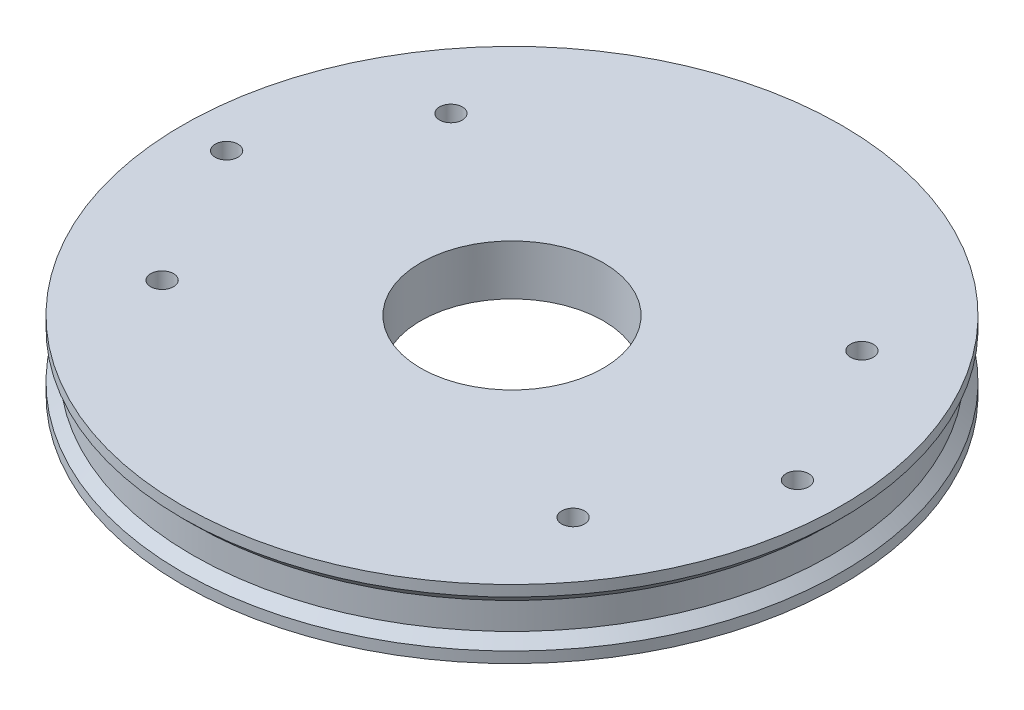
ISO-10303-21;
HEADER;
FILE_DESCRIPTION(('STEP AP214'),'2;1');
FILE_NAME('part.step','',(''),(''),'','','');
FILE_SCHEMA(('AUTOMOTIVE_DESIGN { 1 0 10303 214 1 1 1 1 }'));
ENDSEC;
DATA;
#1=APPLICATION_CONTEXT('core data for automotive mechanical design processes');
#2=APPLICATION_PROTOCOL_DEFINITION('international standard','automotive_design',2000,#1);
#3=PRODUCT_CONTEXT('',#1,'mechanical');
#4=PRODUCT('Part','Part','',(#3));
#5=PRODUCT_RELATED_PRODUCT_CATEGORY('part','',(#4));
#6=PRODUCT_DEFINITION_FORMATION('','',#4);
#7=PRODUCT_DEFINITION_CONTEXT('part definition',#1,'design');
#8=PRODUCT_DEFINITION('design','',#6,#7);
#9=PRODUCT_DEFINITION_SHAPE('','',#8);
#10=(LENGTH_UNIT() NAMED_UNIT(*) SI_UNIT(.MILLI.,.METRE.));
#11=(NAMED_UNIT(*) PLANE_ANGLE_UNIT() SI_UNIT($,.RADIAN.));
#12=(NAMED_UNIT(*) SI_UNIT($,.STERADIAN.) SOLID_ANGLE_UNIT());
#13=UNCERTAINTY_MEASURE_WITH_UNIT(LENGTH_MEASURE(1.E-05),#10,'distance_accuracy_value','');
#14=(GEOMETRIC_REPRESENTATION_CONTEXT(3) GLOBAL_UNCERTAINTY_ASSIGNED_CONTEXT((#13)) GLOBAL_UNIT_ASSIGNED_CONTEXT((#10,
#11,#12)) REPRESENTATION_CONTEXT('',''));
#15=CARTESIAN_POINT('',(0.,0.,0.));
#16=DIRECTION('',(0.,0.,1.));
#17=DIRECTION('',(1.,0.,0.));
#18=AXIS2_PLACEMENT_3D('',#15,#16,#17);
#19=CARTESIAN_POINT('',(0.,7.5,0.));
#20=DIRECTION('',(0.,-1.,0.));
#21=DIRECTION('',(0.,0.,-1.));
#22=AXIS2_PLACEMENT_3D('',#19,#20,#21);
#23=CYLINDRICAL_SURFACE('',#22,20.);
#24=CARTESIAN_POINT('',(0.,7.5,0.));
#25=DIRECTION('',(0.,1.,0.));
#26=DIRECTION('',(0.,0.,1.));
#27=AXIS2_PLACEMENT_3D('',#24,#25,#26);
#28=CIRCLE('',#27,20.);
#29=CARTESIAN_POINT('',(0.,7.5,20.));
#30=VERTEX_POINT('',#29);
#31=EDGE_CURVE('E49',#30,#30,#28,.T.);
#32=ORIENTED_EDGE('',*,*,#31,.T.);
#33=EDGE_LOOP('',(#32));
#34=FACE_BOUND('',#33,.T.);
#35=CARTESIAN_POINT('',(0.,-3.5,0.));
#36=DIRECTION('',(0.,-1.,0.));
#37=DIRECTION('',(0.,0.,-1.));
#38=AXIS2_PLACEMENT_3D('',#35,#36,#37);
#39=CIRCLE('',#38,20.);
#40=CARTESIAN_POINT('',(0.,-3.5,-20.));
#41=VERTEX_POINT('',#40);
#42=EDGE_CURVE('E40',#41,#41,#39,.T.);
#43=ORIENTED_EDGE('',*,*,#42,.T.);
#44=EDGE_LOOP('',(#43));
#45=FACE_BOUND('',#44,.T.);
#46=ADVANCED_FACE('F36',(#34,#45),#23,.F.);
#47=CARTESIAN_POINT('',(0.,7.5,0.));
#48=DIRECTION('',(0.,-1.,0.));
#49=DIRECTION('',(0.,0.,-1.));
#50=AXIS2_PLACEMENT_3D('',#47,#48,#49);
#51=CYLINDRICAL_SURFACE('',#50,72.175);
#52=CARTESIAN_POINT('',(0.,7.5,0.));
#53=DIRECTION('',(0.,1.,0.));
#54=DIRECTION('',(0.,0.,1.));
#55=AXIS2_PLACEMENT_3D('',#52,#53,#54);
#56=CIRCLE('',#55,72.175);
#57=CARTESIAN_POINT('',(0.,7.5,72.175));
#58=VERTEX_POINT('',#57);
#59=EDGE_CURVE('E10',#58,#58,#56,.T.);
#60=ORIENTED_EDGE('',*,*,#59,.F.);
#61=EDGE_LOOP('',(#60));
#62=FACE_BOUND('',#61,.T.);
#63=CARTESIAN_POINT('',(0.,5.115,0.));
#64=DIRECTION('',(0.,1.,0.));
#65=DIRECTION('',(0.,0.,1.));
#66=AXIS2_PLACEMENT_3D('',#63,#64,#65);
#67=CIRCLE('',#66,72.175);
#68=CARTESIAN_POINT('',(0.,5.115,72.175));
#69=VERTEX_POINT('',#68);
#70=EDGE_CURVE('E56',#69,#69,#67,.T.);
#71=ORIENTED_EDGE('',*,*,#70,.T.);
#72=EDGE_LOOP('',(#71));
#73=FACE_BOUND('',#72,.T.);
#74=ADVANCED_FACE('F132',(#62,#73),#51,.T.);
#75=CARTESIAN_POINT('',(0.,7.5,0.));
#76=DIRECTION('',(0.,1.,0.));
#77=DIRECTION('',(0.,0.,1.));
#78=AXIS2_PLACEMENT_3D('',#75,#76,#77);
#79=PLANE('',#78);
#80=CARTESIAN_POINT('',(-62.5,7.5,0.));
#81=DIRECTION('',(0.,-1.,0.));
#82=DIRECTION('',(0.,0.,1.));
#83=AXIS2_PLACEMENT_3D('',#80,#81,#82);
#84=CIRCLE('',#83,2.5);
#85=CARTESIAN_POINT('',(-62.5,7.5,2.5));
#86=VERTEX_POINT('',#85);
#87=EDGE_CURVE('E102',#86,#86,#84,.T.);
#88=ORIENTED_EDGE('',*,*,#87,.T.);
#89=EDGE_LOOP('',(#88));
#90=FACE_BOUND('',#89,.T.);
#91=CARTESIAN_POINT('',(-45.,7.5,-31.6227766016838));
#92=DIRECTION('',(0.,-1.,0.));
#93=DIRECTION('',(0.,0.,1.));
#94=AXIS2_PLACEMENT_3D('',#91,#92,#93);
#95=CIRCLE('',#94,2.5);
#96=CARTESIAN_POINT('',(-45.,7.5,-29.1227766016838));
#97=VERTEX_POINT('',#96);
#98=EDGE_CURVE('E96',#97,#97,#95,.T.);
#99=ORIENTED_EDGE('',*,*,#98,.T.);
#100=EDGE_LOOP('',(#99));
#101=FACE_BOUND('',#100,.T.);
#102=CARTESIAN_POINT('',(-45.,7.5,31.6227766016838));
#103=DIRECTION('',(0.,-1.,0.));
#104=DIRECTION('',(0.,0.,1.));
#105=AXIS2_PLACEMENT_3D('',#102,#103,#104);
#106=CIRCLE('',#105,2.5);
#107=CARTESIAN_POINT('',(-45.,7.5,34.1227766016838));
#108=VERTEX_POINT('',#107);
#109=EDGE_CURVE('E90',#108,#108,#106,.T.);
#110=ORIENTED_EDGE('',*,*,#109,.T.);
#111=EDGE_LOOP('',(#110));
#112=FACE_BOUND('',#111,.T.);
#113=CARTESIAN_POINT('',(62.5,7.5,0.));
#114=DIRECTION('',(0.,1.,0.));
#115=DIRECTION('',(0.,0.,1.));
#116=AXIS2_PLACEMENT_3D('',#113,#114,#115);
#117=CIRCLE('',#116,2.5);
#118=CARTESIAN_POINT('',(62.5,7.5,2.5));
#119=VERTEX_POINT('',#118);
#120=EDGE_CURVE('E85',#119,#119,#117,.T.);
#121=ORIENTED_EDGE('',*,*,#120,.F.);
#122=EDGE_LOOP('',(#121));
#123=FACE_BOUND('',#122,.T.);
#124=CARTESIAN_POINT('',(45.,7.5,-31.6227766016838));
#125=DIRECTION('',(0.,1.,0.));
#126=DIRECTION('',(0.,0.,1.));
#127=AXIS2_PLACEMENT_3D('',#124,#125,#126);
#128=CIRCLE('',#127,2.5);
#129=CARTESIAN_POINT('',(45.,7.5,-29.1227766016838));
#130=VERTEX_POINT('',#129);
#131=EDGE_CURVE('E79',#130,#130,#128,.T.);
#132=ORIENTED_EDGE('',*,*,#131,.F.);
#133=EDGE_LOOP('',(#132));
#134=FACE_BOUND('',#133,.T.);
#135=CARTESIAN_POINT('',(45.,7.5,31.6227766016838));
#136=DIRECTION('',(0.,1.,0.));
#137=DIRECTION('',(0.,0.,1.));
#138=AXIS2_PLACEMENT_3D('',#135,#136,#137);
#139=CIRCLE('',#138,2.5);
#140=CARTESIAN_POINT('',(45.,7.5,34.1227766016838));
#141=VERTEX_POINT('',#140);
#142=EDGE_CURVE('E72',#141,#141,#139,.T.);
#143=ORIENTED_EDGE('',*,*,#142,.F.);
#144=EDGE_LOOP('',(#143));
#145=FACE_BOUND('',#144,.T.);
#146=ORIENTED_EDGE('',*,*,#59,.T.);
#147=EDGE_LOOP('',(#146));
#148=FACE_BOUND('',#147,.T.);
#149=ORIENTED_EDGE('',*,*,#31,.F.);
#150=EDGE_LOOP('',(#149));
#151=FACE_BOUND('',#150,.T.);
#152=ADVANCED_FACE('F114',(#90,#101,#112,#123,#134,#145,#148,#151),#79,.T.);
#153=CARTESIAN_POINT('',(0.,-7.5,0.));
#154=DIRECTION('',(0.,1.,0.));
#155=DIRECTION('',(0.,0.,1.));
#156=AXIS2_PLACEMENT_3D('',#153,#154,#155);
#157=PLANE('',#156);
#158=CARTESIAN_POINT('',(-62.5,-7.5,0.));
#159=DIRECTION('',(0.,-1.,0.));
#160=DIRECTION('',(0.,0.,1.));
#161=AXIS2_PLACEMENT_3D('',#158,#159,#160);
#162=CIRCLE('',#161,2.5);
#163=CARTESIAN_POINT('',(-62.5,-7.5,2.5));
#164=VERTEX_POINT('',#163);
#165=EDGE_CURVE('E76',#164,#164,#162,.T.);
#166=ORIENTED_EDGE('',*,*,#165,.F.);
#167=EDGE_LOOP('',(#166));
#168=FACE_BOUND('',#167,.T.);
#169=CARTESIAN_POINT('',(-45.,-7.5,-31.6227766016838));
#170=DIRECTION('',(0.,-1.,0.));
#171=DIRECTION('',(0.,0.,1.));
#172=AXIS2_PLACEMENT_3D('',#169,#170,#171);
#173=CIRCLE('',#172,2.5);
#174=CARTESIAN_POINT('',(-45.,-7.5,-29.1227766016838));
#175=VERTEX_POINT('',#174);
#176=EDGE_CURVE('E99',#175,#175,#173,.T.);
#177=ORIENTED_EDGE('',*,*,#176,.F.);
#178=EDGE_LOOP('',(#177));
#179=FACE_BOUND('',#178,.T.);
#180=CARTESIAN_POINT('',(-45.,-7.5,31.6227766016838));
#181=DIRECTION('',(0.,-1.,0.));
#182=DIRECTION('',(0.,0.,1.));
#183=AXIS2_PLACEMENT_3D('',#180,#181,#182);
#184=CIRCLE('',#183,2.5);
#185=CARTESIAN_POINT('',(-45.,-7.5,34.1227766016838));
#186=VERTEX_POINT('',#185);
#187=EDGE_CURVE('E93',#186,#186,#184,.T.);
#188=ORIENTED_EDGE('',*,*,#187,.F.);
#189=EDGE_LOOP('',(#188));
#190=FACE_BOUND('',#189,.T.);
#191=CARTESIAN_POINT('',(62.5,-7.5,0.));
#192=DIRECTION('',(0.,1.,0.));
#193=DIRECTION('',(0.,0.,1.));
#194=AXIS2_PLACEMENT_3D('',#191,#192,#193);
#195=CIRCLE('',#194,2.5);
#196=CARTESIAN_POINT('',(62.5,-7.5,2.5));
#197=VERTEX_POINT('',#196);
#198=EDGE_CURVE('E69',#197,#197,#195,.T.);
#199=ORIENTED_EDGE('',*,*,#198,.T.);
#200=EDGE_LOOP('',(#199));
#201=FACE_BOUND('',#200,.T.);
#202=CARTESIAN_POINT('',(45.,-7.5,-31.6227766016838));
#203=DIRECTION('',(0.,1.,0.));
#204=DIRECTION('',(0.,0.,1.));
#205=AXIS2_PLACEMENT_3D('',#202,#203,#204);
#206=CIRCLE('',#205,2.5);
#207=CARTESIAN_POINT('',(45.,-7.5,-29.1227766016838));
#208=VERTEX_POINT('',#207);
#209=EDGE_CURVE('E82',#208,#208,#206,.T.);
#210=ORIENTED_EDGE('',*,*,#209,.T.);
#211=EDGE_LOOP('',(#210));
#212=FACE_BOUND('',#211,.T.);
#213=CARTESIAN_POINT('',(45.,-7.5,31.6227766016838));
#214=DIRECTION('',(0.,1.,0.));
#215=DIRECTION('',(0.,0.,1.));
#216=AXIS2_PLACEMENT_3D('',#213,#214,#215);
#217=CIRCLE('',#216,2.5);
#218=CARTESIAN_POINT('',(45.,-7.5,34.1227766016838));
#219=VERTEX_POINT('',#218);
#220=EDGE_CURVE('E75',#219,#219,#217,.T.);
#221=ORIENTED_EDGE('',*,*,#220,.T.);
#222=EDGE_LOOP('',(#221));
#223=FACE_BOUND('',#222,.T.);
#224=CARTESIAN_POINT('',(0.,-7.5,0.));
#225=DIRECTION('',(0.,-1.,0.));
#226=DIRECTION('',(0.,0.,-1.));
#227=AXIS2_PLACEMENT_3D('',#224,#225,#226);
#228=CIRCLE('',#227,30.5);
#229=CARTESIAN_POINT('',(0.,-7.5,-30.5));
#230=VERTEX_POINT('',#229);
#231=EDGE_CURVE('E65',#230,#230,#228,.T.);
#232=ORIENTED_EDGE('',*,*,#231,.F.);
#233=EDGE_LOOP('',(#232));
#234=FACE_BOUND('',#233,.T.);
#235=CARTESIAN_POINT('',(0.,-7.5,0.));
#236=DIRECTION('',(0.,1.,0.));
#237=DIRECTION('',(0.,0.,1.));
#238=AXIS2_PLACEMENT_3D('',#235,#236,#237);
#239=CIRCLE('',#238,72.175);
#240=CARTESIAN_POINT('',(0.,-7.5,72.175));
#241=VERTEX_POINT('',#240);
#242=EDGE_CURVE('E44',#241,#241,#239,.T.);
#243=ORIENTED_EDGE('',*,*,#242,.F.);
#244=EDGE_LOOP('',(#243));
#245=FACE_BOUND('',#244,.T.);
#246=ADVANCED_FACE('F111',(#168,#179,#190,#201,#212,#223,#234,#245),#157,.F.);
#247=CARTESIAN_POINT('',(0.,-5.115,0.));
#248=DIRECTION('',(0.,1.,0.));
#249=DIRECTION('',(0.,0.,1.));
#250=AXIS2_PLACEMENT_3D('',#247,#248,#249);
#251=CIRCLE('',#250,72.175);
#252=CARTESIAN_POINT('',(0.,-5.115,72.175));
#253=VERTEX_POINT('',#252);
#254=EDGE_CURVE('E53',#253,#253,#251,.T.);
#255=ORIENTED_EDGE('',*,*,#254,.F.);
#256=EDGE_LOOP('',(#255));
#257=FACE_BOUND('',#256,.T.);
#258=ORIENTED_EDGE('',*,*,#242,.T.);
#259=EDGE_LOOP('',(#258));
#260=FACE_BOUND('',#259,.T.);
#261=ADVANCED_FACE('F38',(#257,#260),#51,.T.);
#262=CARTESIAN_POINT('',(0.,-5.115,0.));
#263=DIRECTION('',(0.,-1.,0.));
#264=DIRECTION('',(0.,0.,-1.));
#265=AXIS2_PLACEMENT_3D('',#262,#263,#264);
#266=CONICAL_SURFACE('',#265,72.175,0.785398163397443);
#267=CARTESIAN_POINT('',(0.,-2.94000000000001,0.));
#268=DIRECTION('',(0.,1.,0.));
#269=DIRECTION('',(0.,0.,1.));
#270=AXIS2_PLACEMENT_3D('',#267,#268,#269);
#271=CIRCLE('',#270,70.);
#272=CARTESIAN_POINT('',(0.,-2.94000000000001,70.));
#273=VERTEX_POINT('',#272);
#274=EDGE_CURVE('E62',#273,#273,#271,.T.);
#275=ORIENTED_EDGE('',*,*,#274,.F.);
#276=EDGE_LOOP('',(#275));
#277=FACE_BOUND('',#276,.T.);
#278=ORIENTED_EDGE('',*,*,#254,.T.);
#279=EDGE_LOOP('',(#278));
#280=FACE_BOUND('',#279,.T.);
#281=ADVANCED_FACE('F130',(#277,#280),#266,.T.);
#282=CARTESIAN_POINT('',(0.,5.115,0.));
#283=DIRECTION('',(0.,1.,0.));
#284=DIRECTION('',(0.,0.,1.));
#285=AXIS2_PLACEMENT_3D('',#282,#283,#284);
#286=CONICAL_SURFACE('',#285,72.175,0.785398163397443);
#287=CARTESIAN_POINT('',(0.,2.94000000000001,0.));
#288=DIRECTION('',(0.,1.,0.));
#289=DIRECTION('',(0.,0.,1.));
#290=AXIS2_PLACEMENT_3D('',#287,#288,#289);
#291=CIRCLE('',#290,70.);
#292=CARTESIAN_POINT('',(0.,2.94000000000001,70.));
#293=VERTEX_POINT('',#292);
#294=EDGE_CURVE('E59',#293,#293,#291,.T.);
#295=ORIENTED_EDGE('',*,*,#294,.T.);
#296=EDGE_LOOP('',(#295));
#297=FACE_BOUND('',#296,.T.);
#298=ORIENTED_EDGE('',*,*,#70,.F.);
#299=EDGE_LOOP('',(#298));
#300=FACE_BOUND('',#299,.T.);
#301=ADVANCED_FACE('F137',(#297,#300),#286,.T.);
#302=CARTESIAN_POINT('',(0.,6.6,0.));
#303=DIRECTION('',(0.,1.,0.));
#304=DIRECTION('',(0.,0.,1.));
#305=AXIS2_PLACEMENT_3D('',#302,#303,#304);
#306=CYLINDRICAL_SURFACE('',#305,70.);
#307=ORIENTED_EDGE('',*,*,#274,.T.);
#308=EDGE_LOOP('',(#307));
#309=FACE_BOUND('',#308,.T.);
#310=ORIENTED_EDGE('',*,*,#294,.F.);
#311=EDGE_LOOP('',(#310));
#312=FACE_BOUND('',#311,.T.);
#313=ADVANCED_FACE('F190',(#309,#312),#306,.T.);
#314=CARTESIAN_POINT('',(0.,-3.5,0.));
#315=DIRECTION('',(0.,-1.,0.));
#316=DIRECTION('',(0.,0.,-1.));
#317=AXIS2_PLACEMENT_3D('',#314,#315,#316);
#318=CYLINDRICAL_SURFACE('',#317,30.5);
#319=CARTESIAN_POINT('',(0.,-3.5,0.));
#320=DIRECTION('',(0.,-1.,0.));
#321=DIRECTION('',(0.,0.,-1.));
#322=AXIS2_PLACEMENT_3D('',#319,#320,#321);
#323=CIRCLE('',#322,30.5);
#324=CARTESIAN_POINT('',(0.,-3.5,-30.5));
#325=VERTEX_POINT('',#324);
#326=EDGE_CURVE('E68',#325,#325,#323,.T.);
#327=ORIENTED_EDGE('',*,*,#326,.F.);
#328=EDGE_LOOP('',(#327));
#329=FACE_BOUND('',#328,.T.);
#330=ORIENTED_EDGE('',*,*,#231,.T.);
#331=EDGE_LOOP('',(#330));
#332=FACE_BOUND('',#331,.T.);
#333=ADVANCED_FACE('F183',(#329,#332),#318,.F.);
#334=CARTESIAN_POINT('',(0.,-3.5,0.));
#335=DIRECTION('',(0.,-1.,0.));
#336=DIRECTION('',(0.,0.,-1.));
#337=AXIS2_PLACEMENT_3D('',#334,#335,#336);
#338=PLANE('',#337);
#339=ORIENTED_EDGE('',*,*,#42,.F.);
#340=EDGE_LOOP('',(#339));
#341=FACE_BOUND('',#340,.T.);
#342=ORIENTED_EDGE('',*,*,#326,.T.);
#343=EDGE_LOOP('',(#342));
#344=FACE_BOUND('',#343,.T.);
#345=ADVANCED_FACE('F173',(#341,#344),#338,.T.);
#346=CARTESIAN_POINT('',(45.,-7.5,31.6227766016838));
#347=DIRECTION('',(0.,1.,0.));
#348=DIRECTION('',(0.,0.,1.));
#349=AXIS2_PLACEMENT_3D('',#346,#347,#348);
#350=CYLINDRICAL_SURFACE('',#349,2.5);
#351=ORIENTED_EDGE('',*,*,#220,.F.);
#352=EDGE_LOOP('',(#351));
#353=FACE_BOUND('',#352,.T.);
#354=ORIENTED_EDGE('',*,*,#142,.T.);
#355=EDGE_LOOP('',(#354));
#356=FACE_BOUND('',#355,.T.);
#357=ADVANCED_FACE('F170',(#353,#356),#350,.F.);
#358=CARTESIAN_POINT('',(45.,-7.5,-31.6227766016838));
#359=DIRECTION('',(0.,1.,0.));
#360=DIRECTION('',(0.,0.,1.));
#361=AXIS2_PLACEMENT_3D('',#358,#359,#360);
#362=CYLINDRICAL_SURFACE('',#361,2.5);
#363=ORIENTED_EDGE('',*,*,#209,.F.);
#364=EDGE_LOOP('',(#363));
#365=FACE_BOUND('',#364,.T.);
#366=ORIENTED_EDGE('',*,*,#131,.T.);
#367=EDGE_LOOP('',(#366));
#368=FACE_BOUND('',#367,.T.);
#369=ADVANCED_FACE('F172',(#365,#368),#362,.F.);
#370=CARTESIAN_POINT('',(62.5,-7.5,0.));
#371=DIRECTION('',(0.,1.,0.));
#372=DIRECTION('',(0.,0.,1.));
#373=AXIS2_PLACEMENT_3D('',#370,#371,#372);
#374=CYLINDRICAL_SURFACE('',#373,2.5);
#375=ORIENTED_EDGE('',*,*,#198,.F.);
#376=EDGE_LOOP('',(#375));
#377=FACE_BOUND('',#376,.T.);
#378=ORIENTED_EDGE('',*,*,#120,.T.);
#379=EDGE_LOOP('',(#378));
#380=FACE_BOUND('',#379,.T.);
#381=ADVANCED_FACE('F180',(#377,#380),#374,.F.);
#382=CARTESIAN_POINT('',(-45.,-7.5,31.6227766016838));
#383=DIRECTION('',(0.,1.,0.));
#384=DIRECTION('',(0.,0.,1.));
#385=AXIS2_PLACEMENT_3D('',#382,#383,#384);
#386=CYLINDRICAL_SURFACE('',#385,2.5);
#387=ORIENTED_EDGE('',*,*,#187,.T.);
#388=EDGE_LOOP('',(#387));
#389=FACE_BOUND('',#388,.T.);
#390=ORIENTED_EDGE('',*,*,#109,.F.);
#391=EDGE_LOOP('',(#390));
#392=FACE_BOUND('',#391,.T.);
#393=ADVANCED_FACE('F234',(#389,#392),#386,.F.);
#394=CARTESIAN_POINT('',(-45.,-7.5,-31.6227766016838));
#395=DIRECTION('',(0.,1.,0.));
#396=DIRECTION('',(0.,0.,1.));
#397=AXIS2_PLACEMENT_3D('',#394,#395,#396);
#398=CYLINDRICAL_SURFACE('',#397,2.5);
#399=ORIENTED_EDGE('',*,*,#176,.T.);
#400=EDGE_LOOP('',(#399));
#401=FACE_BOUND('',#400,.T.);
#402=ORIENTED_EDGE('',*,*,#98,.F.);
#403=EDGE_LOOP('',(#402));
#404=FACE_BOUND('',#403,.T.);
#405=ADVANCED_FACE('F244',(#401,#404),#398,.F.);
#406=CARTESIAN_POINT('',(-62.5,-7.5,0.));
#407=DIRECTION('',(0.,1.,0.));
#408=DIRECTION('',(0.,0.,1.));
#409=AXIS2_PLACEMENT_3D('',#406,#407,#408);
#410=CYLINDRICAL_SURFACE('',#409,2.5);
#411=ORIENTED_EDGE('',*,*,#165,.T.);
#412=EDGE_LOOP('',(#411));
#413=FACE_BOUND('',#412,.T.);
#414=ORIENTED_EDGE('',*,*,#87,.F.);
#415=EDGE_LOOP('',(#414));
#416=FACE_BOUND('',#415,.T.);
#417=ADVANCED_FACE('F108',(#413,#416),#410,.F.);
#418=CLOSED_SHELL('',(#46,#74,#152,#246,#261,#281,#301,#313,#333,#345,#357,#369,#381,#393,#405,#417));
#419=MANIFOLD_SOLID_BREP('B2',#418);
#420=ADVANCED_BREP_SHAPE_REPRESENTATION('',(#18,#419),#14);
#421=SHAPE_DEFINITION_REPRESENTATION(#9,#420);
ENDSEC;
END-ISO-10303-21;
